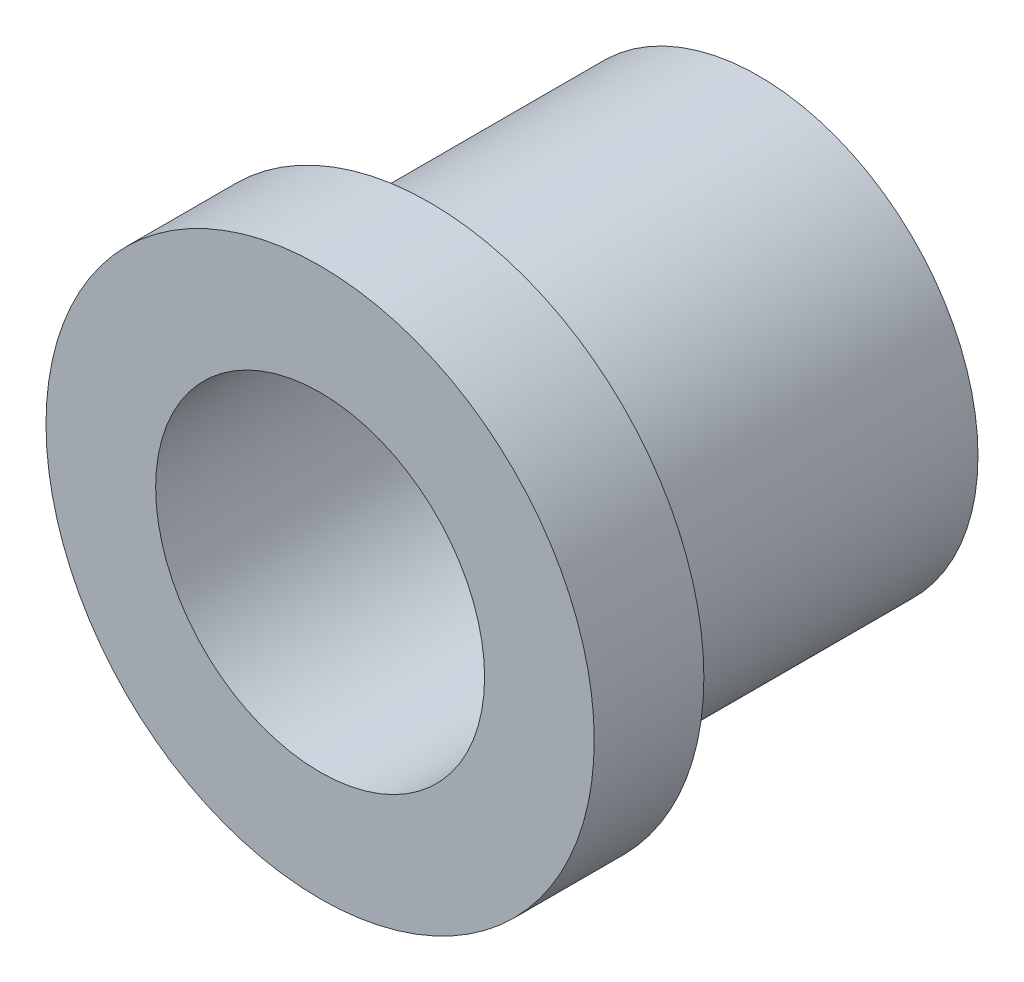
ISO-10303-21;
HEADER;
FILE_DESCRIPTION(('STEP AP214'),'2;1');
FILE_NAME('part.step','',(''),(''),'','','');
FILE_SCHEMA(('AUTOMOTIVE_DESIGN { 1 0 10303 214 1 1 1 1 }'));
ENDSEC;
DATA;
#1=APPLICATION_CONTEXT('core data for automotive mechanical design processes');
#2=APPLICATION_PROTOCOL_DEFINITION('international standard','automotive_design',2000,#1);
#3=PRODUCT_CONTEXT('',#1,'mechanical');
#4=PRODUCT('Part','Part','',(#3));
#5=PRODUCT_RELATED_PRODUCT_CATEGORY('part','',(#4));
#6=PRODUCT_DEFINITION_FORMATION('','',#4);
#7=PRODUCT_DEFINITION_CONTEXT('part definition',#1,'design');
#8=PRODUCT_DEFINITION('design','',#6,#7);
#9=PRODUCT_DEFINITION_SHAPE('','',#8);
#10=(LENGTH_UNIT() NAMED_UNIT(*) SI_UNIT(.MILLI.,.METRE.));
#11=(NAMED_UNIT(*) PLANE_ANGLE_UNIT() SI_UNIT($,.RADIAN.));
#12=(NAMED_UNIT(*) SI_UNIT($,.STERADIAN.) SOLID_ANGLE_UNIT());
#13=UNCERTAINTY_MEASURE_WITH_UNIT(LENGTH_MEASURE(1.E-05),#10,'distance_accuracy_value','');
#14=(GEOMETRIC_REPRESENTATION_CONTEXT(3) GLOBAL_UNCERTAINTY_ASSIGNED_CONTEXT((#13)) GLOBAL_UNIT_ASSIGNED_CONTEXT((#10,
#11,#12)) REPRESENTATION_CONTEXT('',''));
#15=CARTESIAN_POINT('',(0.,0.,0.));
#16=DIRECTION('',(0.,0.,1.));
#17=DIRECTION('',(1.,0.,0.));
#18=AXIS2_PLACEMENT_3D('',#15,#16,#17);
#19=CARTESIAN_POINT('',(0.,4.7625,0.));
#20=DIRECTION('',(0.,0.,-1.));
#21=DIRECTION('',(-1.,0.,0.));
#22=AXIS2_PLACEMENT_3D('',#19,#20,#21);
#23=PLANE('',#22);
#24=CARTESIAN_POINT('',(0.,0.,0.));
#25=DIRECTION('',(0.,0.,1.));
#26=DIRECTION('',(1.,0.,0.));
#27=AXIS2_PLACEMENT_3D('',#24,#25,#26);
#28=CIRCLE('',#27,4.7625);
#29=CARTESIAN_POINT('',(4.7625,0.,0.));
#30=VERTEX_POINT('',#29);
#31=EDGE_CURVE('E53',#30,#30,#28,.T.);
#32=ORIENTED_EDGE('',*,*,#31,.F.);
#33=EDGE_LOOP('',(#32));
#34=FACE_BOUND('',#33,.T.);
#35=CARTESIAN_POINT('',(0.,0.,0.));
#36=DIRECTION('',(0.,0.,1.));
#37=DIRECTION('',(1.,0.,0.));
#38=AXIS2_PLACEMENT_3D('',#35,#36,#37);
#39=CIRCLE('',#38,7.9375);
#40=CARTESIAN_POINT('',(7.9375,0.,0.));
#41=VERTEX_POINT('',#40);
#42=EDGE_CURVE('E10',#41,#41,#39,.T.);
#43=ORIENTED_EDGE('',*,*,#42,.T.);
#44=EDGE_LOOP('',(#43));
#45=FACE_BOUND('',#44,.T.);
#46=ADVANCED_FACE('F31',(#34,#45),#23,.F.);
#47=CARTESIAN_POINT('',(0.,0.,0.));
#48=DIRECTION('',(0.,0.,1.));
#49=DIRECTION('',(1.,0.,0.));
#50=AXIS2_PLACEMENT_3D('',#47,#48,#49);
#51=CYLINDRICAL_SURFACE('',#50,7.9375);
#52=ORIENTED_EDGE('',*,*,#42,.F.);
#53=EDGE_LOOP('',(#52));
#54=FACE_BOUND('',#53,.T.);
#55=CARTESIAN_POINT('',(0.,0.,-3.175));
#56=DIRECTION('',(0.,0.,1.));
#57=DIRECTION('',(1.,0.,0.));
#58=AXIS2_PLACEMENT_3D('',#55,#56,#57);
#59=CIRCLE('',#58,7.93750000000001);
#60=CARTESIAN_POINT('',(7.93750000000001,0.,-3.175));
#61=VERTEX_POINT('',#60);
#62=EDGE_CURVE('E37',#61,#61,#59,.T.);
#63=ORIENTED_EDGE('',*,*,#62,.T.);
#64=EDGE_LOOP('',(#63));
#65=FACE_BOUND('',#64,.T.);
#66=ADVANCED_FACE('F60',(#54,#65),#51,.T.);
#67=CARTESIAN_POINT('',(0.,7.93750000000001,-3.175));
#68=DIRECTION('',(0.,0.,1.));
#69=DIRECTION('',(1.,0.,0.));
#70=AXIS2_PLACEMENT_3D('',#67,#68,#69);
#71=PLANE('',#70);
#72=ORIENTED_EDGE('',*,*,#62,.F.);
#73=EDGE_LOOP('',(#72));
#74=FACE_BOUND('',#73,.T.);
#75=CARTESIAN_POINT('',(0.,0.,-3.175));
#76=DIRECTION('',(0.,0.,1.));
#77=DIRECTION('',(1.,0.,0.));
#78=AXIS2_PLACEMENT_3D('',#75,#76,#77);
#79=CIRCLE('',#78,6.35);
#80=CARTESIAN_POINT('',(6.35,0.,-3.175));
#81=VERTEX_POINT('',#80);
#82=EDGE_CURVE('E41',#81,#81,#79,.T.);
#83=ORIENTED_EDGE('',*,*,#82,.T.);
#84=EDGE_LOOP('',(#83));
#85=FACE_BOUND('',#84,.T.);
#86=ADVANCED_FACE('F64',(#74,#85),#71,.F.);
#87=CARTESIAN_POINT('',(0.,0.,0.));
#88=DIRECTION('',(0.,0.,1.));
#89=DIRECTION('',(1.,0.,0.));
#90=AXIS2_PLACEMENT_3D('',#87,#88,#89);
#91=CYLINDRICAL_SURFACE('',#90,6.35);
#92=ORIENTED_EDGE('',*,*,#82,.F.);
#93=EDGE_LOOP('',(#92));
#94=FACE_BOUND('',#93,.T.);
#95=CARTESIAN_POINT('',(0.,0.,-12.7));
#96=DIRECTION('',(0.,0.,1.));
#97=DIRECTION('',(1.,0.,0.));
#98=AXIS2_PLACEMENT_3D('',#95,#96,#97);
#99=CIRCLE('',#98,6.35);
#100=CARTESIAN_POINT('',(6.35,0.,-12.7));
#101=VERTEX_POINT('',#100);
#102=EDGE_CURVE('E45',#101,#101,#99,.T.);
#103=ORIENTED_EDGE('',*,*,#102,.T.);
#104=EDGE_LOOP('',(#103));
#105=FACE_BOUND('',#104,.T.);
#106=ADVANCED_FACE('F69',(#94,#105),#91,.T.);
#107=CARTESIAN_POINT('',(0.,6.35,-12.7));
#108=DIRECTION('',(0.,0.,1.));
#109=DIRECTION('',(1.,0.,0.));
#110=AXIS2_PLACEMENT_3D('',#107,#108,#109);
#111=PLANE('',#110);
#112=ORIENTED_EDGE('',*,*,#102,.F.);
#113=EDGE_LOOP('',(#112));
#114=FACE_BOUND('',#113,.T.);
#115=CARTESIAN_POINT('',(0.,0.,-12.7));
#116=DIRECTION('',(0.,0.,1.));
#117=DIRECTION('',(1.,0.,0.));
#118=AXIS2_PLACEMENT_3D('',#115,#116,#117);
#119=CIRCLE('',#118,4.7625);
#120=CARTESIAN_POINT('',(4.7625,0.,-12.7));
#121=VERTEX_POINT('',#120);
#122=EDGE_CURVE('E50',#121,#121,#119,.T.);
#123=ORIENTED_EDGE('',*,*,#122,.T.);
#124=EDGE_LOOP('',(#123));
#125=FACE_BOUND('',#124,.T.);
#126=ADVANCED_FACE('F75',(#114,#125),#111,.F.);
#127=CARTESIAN_POINT('',(0.,0.,0.));
#128=DIRECTION('',(0.,0.,1.));
#129=DIRECTION('',(1.,0.,0.));
#130=AXIS2_PLACEMENT_3D('',#127,#128,#129);
#131=CYLINDRICAL_SURFACE('',#130,4.7625);
#132=ORIENTED_EDGE('',*,*,#122,.F.);
#133=EDGE_LOOP('',(#132));
#134=FACE_BOUND('',#133,.T.);
#135=ORIENTED_EDGE('',*,*,#31,.T.);
#136=EDGE_LOOP('',(#135));
#137=FACE_BOUND('',#136,.T.);
#138=ADVANCED_FACE('F57',(#134,#137),#131,.F.);
#139=CLOSED_SHELL('',(#46,#66,#86,#106,#126,#138));
#140=MANIFOLD_SOLID_BREP('B2',#139);
#141=ADVANCED_BREP_SHAPE_REPRESENTATION('',(#18,#140),#14);
#142=SHAPE_DEFINITION_REPRESENTATION(#9,#141);
ENDSEC;
END-ISO-10303-21;
